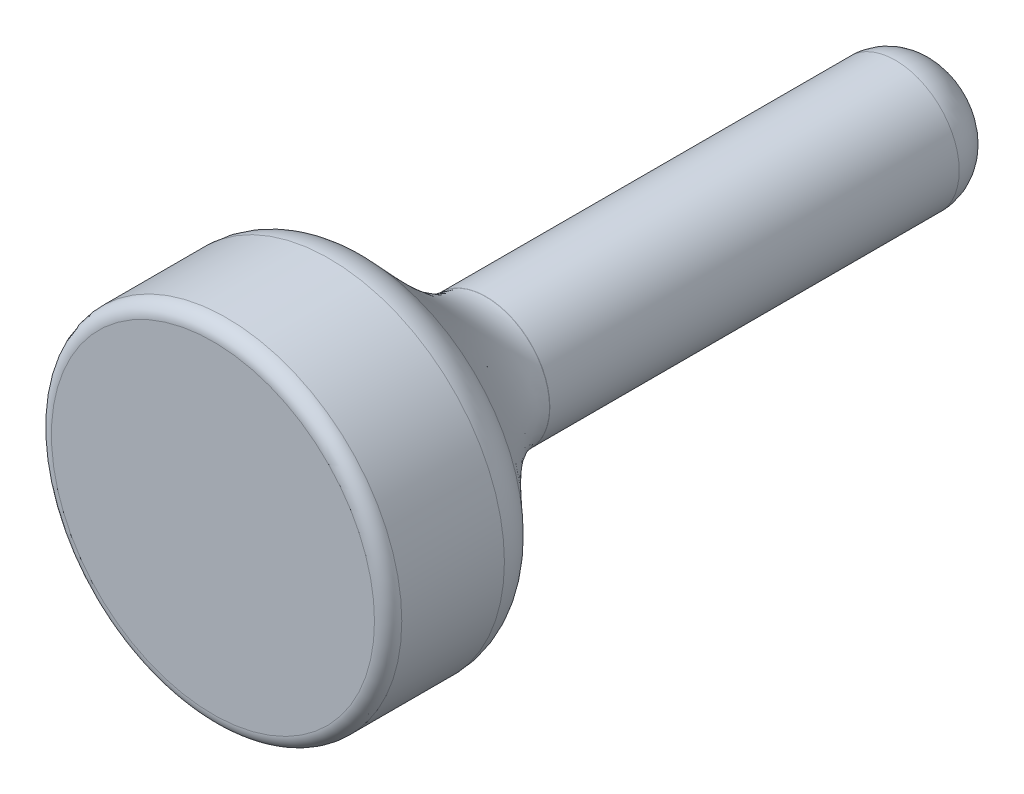
ISO-10303-21;
HEADER;
FILE_DESCRIPTION(('STEP AP214'),'2;1');
FILE_NAME('part.step','',(''),(''),'','','');
FILE_SCHEMA(('AUTOMOTIVE_DESIGN { 1 0 10303 214 1 1 1 1 }'));
ENDSEC;
DATA;
#1=APPLICATION_CONTEXT('core data for automotive mechanical design processes');
#2=APPLICATION_PROTOCOL_DEFINITION('international standard','automotive_design',2000,#1);
#3=PRODUCT_CONTEXT('',#1,'mechanical');
#4=PRODUCT('Part','Part','',(#3));
#5=PRODUCT_RELATED_PRODUCT_CATEGORY('part','',(#4));
#6=PRODUCT_DEFINITION_FORMATION('','',#4);
#7=PRODUCT_DEFINITION_CONTEXT('part definition',#1,'design');
#8=PRODUCT_DEFINITION('design','',#6,#7);
#9=PRODUCT_DEFINITION_SHAPE('','',#8);
#10=(LENGTH_UNIT() NAMED_UNIT(*) SI_UNIT(.MILLI.,.METRE.));
#11=(NAMED_UNIT(*) PLANE_ANGLE_UNIT() SI_UNIT($,.RADIAN.));
#12=(NAMED_UNIT(*) SI_UNIT($,.STERADIAN.) SOLID_ANGLE_UNIT());
#13=UNCERTAINTY_MEASURE_WITH_UNIT(LENGTH_MEASURE(1.E-05),#10,'distance_accuracy_value','');
#14=(GEOMETRIC_REPRESENTATION_CONTEXT(3) GLOBAL_UNCERTAINTY_ASSIGNED_CONTEXT((#13)) GLOBAL_UNIT_ASSIGNED_CONTEXT((#10,
#11,#12)) REPRESENTATION_CONTEXT('',''));
#15=CARTESIAN_POINT('',(0.,0.,0.));
#16=DIRECTION('',(0.,0.,1.));
#17=DIRECTION('',(1.,0.,0.));
#18=AXIS2_PLACEMENT_3D('',#15,#16,#17);
#19=CARTESIAN_POINT('',(0.,0.,3.));
#20=DIRECTION('',(0.,0.,-1.));
#21=DIRECTION('',(-1.,0.,0.));
#22=AXIS2_PLACEMENT_3D('',#19,#20,#21);
#23=CYLINDRICAL_SURFACE('',#22,3.85);
#24=CARTESIAN_POINT('',(0.,0.,2.7));
#25=DIRECTION('',(0.,0.,1.));
#26=DIRECTION('',(1.,0.,0.));
#27=AXIS2_PLACEMENT_3D('',#24,#25,#26);
#28=CIRCLE('',#27,3.85);
#29=CARTESIAN_POINT('',(3.85,0.,2.7));
#30=VERTEX_POINT('',#29);
#31=EDGE_CURVE('E11',#30,#30,#28,.F.);
#32=ORIENTED_EDGE('',*,*,#31,.T.);
#33=EDGE_LOOP('',(#32));
#34=FACE_BOUND('',#33,.T.);
#35=CARTESIAN_POINT('',(0.,0.,0.444868123086891));
#36=DIRECTION('',(0.,0.,1.));
#37=DIRECTION('',(1.,0.,0.));
#38=AXIS2_PLACEMENT_3D('',#35,#36,#37);
#39=CIRCLE('',#38,3.85);
#40=CARTESIAN_POINT('',(3.85,0.,0.444868123086891));
#41=VERTEX_POINT('',#40);
#42=EDGE_CURVE('E60',#41,#41,#39,.T.);
#43=ORIENTED_EDGE('',*,*,#42,.T.);
#44=EDGE_LOOP('',(#43));
#45=FACE_BOUND('',#44,.T.);
#46=ADVANCED_FACE('F34',(#34,#45),#23,.T.);
#47=CARTESIAN_POINT('',(0.,0.,3.));
#48=DIRECTION('',(0.,0.,1.));
#49=DIRECTION('',(1.,0.,0.));
#50=AXIS2_PLACEMENT_3D('',#47,#48,#49);
#51=PLANE('',#50);
#52=CARTESIAN_POINT('',(0.,0.,3.));
#53=DIRECTION('',(0.,0.,1.));
#54=DIRECTION('',(1.,0.,0.));
#55=AXIS2_PLACEMENT_3D('',#52,#53,#54);
#56=CIRCLE('',#55,3.55);
#57=CARTESIAN_POINT('',(3.55,0.,3.));
#58=VERTEX_POINT('',#57);
#59=EDGE_CURVE('E41',#58,#58,#56,.T.);
#60=ORIENTED_EDGE('',*,*,#59,.T.);
#61=EDGE_LOOP('',(#60));
#62=FACE_BOUND('',#61,.T.);
#63=ADVANCED_FACE('F88',(#62),#51,.T.);
#64=CARTESIAN_POINT('',(1.93267632489782,3.32975407848379,0.));
#65=CARTESIAN_POINT('',(1.38164535738255,-0.225955983375615,-3.));
#66=CARTESIAN_POINT('',(8.59218448186541,-0.535598571311848,0.));
#67=CARTESIAN_POINT('',(0.929733390631321,-2.98924669814072,-3.));
#68=CARTESIAN_POINT('',(4.72683183206976,-7.19510672827944,0.));
#69=CARTESIAN_POINT('',(-1.83355732413378,-2.53733473138949,-3.));
#70=CARTESIAN_POINT('',(-1.93267632489782,-3.32975407848379,0.));
#71=CARTESIAN_POINT('',(-1.38164535738255,0.225955983375616,-3.));
#72=CARTESIAN_POINT('',(-8.59218448186541,0.535598571311851,0.));
#73=CARTESIAN_POINT('',(-0.92973339063132,2.98924669814072,-3.));
#74=CARTESIAN_POINT('',(-4.72683183206977,7.19510672827944,0.));
#75=CARTESIAN_POINT('',(1.83355732413378,2.53733473138949,-3.));
#76=CARTESIAN_POINT('',(1.93267632489782,3.32975407848379,0.));
#77=CARTESIAN_POINT('',(1.38164535738255,-0.225955983375615,-3.));
#78=(BOUNDED_SURFACE() B_SPLINE_SURFACE(3,1,((#64,#65),(#66,#67),(#68,#69),(#70,#71),(#72,#73),
(#74,#75),(#76,#77)),.UNSPECIFIED.,.T.,.F.,.F.) B_SPLINE_SURFACE_WITH_KNOTS((4,3,4),(2,2),(0.,
0.5,1.),(0.,1.),.UNSPECIFIED.) GEOMETRIC_REPRESENTATION_ITEM() RATIONAL_B_SPLINE_SURFACE(((1.,
1.),(0.333333333333333,0.333333333333333),(0.333333333333333,0.333333333333333),(1.,1.),
(0.333333333333333,0.333333333333333),(0.333333333333333,0.333333333333333),(1.,1.))) REPRESENTATION_ITEM('') SURFACE());
#79=CARTESIAN_POINT('',(0.,0.,-2.99709545008863));
#80=DIRECTION('',(0.,0.,-1.));
#81=DIRECTION('',(-1.,0.,0.));
#82=AXIS2_PLACEMENT_3D('',#79,#80,#81);
#83=CIRCLE('',#82,1.39997521623012);
#84=CARTESIAN_POINT('',(1.38217885636517,-0.222513404260607,-2.99709545008863));
#85=VERTEX_POINT('',#84);
#86=EDGE_CURVE('E45',#85,#85,#83,.F.);
#87=CARTESIAN_POINT('',(0.,0.,-0.295252106152373));
#88=DIRECTION('',(0.,0.,-1.));
#89=DIRECTION('',(-1.,0.,0.));
#90=AXIS2_PLACEMENT_3D('',#87,#88,#89);
#91=CIRCLE('',#90,3.52247456923724);
#92=CARTESIAN_POINT('',(1.87844530699313,2.9798104502734,-0.295252106152373));
#93=VERTEX_POINT('',#92);
#94=EDGE_CURVE('E63',#93,#93,#91,.T.);
#95=CARTESIAN_POINT('',(1.38217885636517,-0.222513404260607,-2.99709545008863));
#96=CARTESIAN_POINT('',(1.38734829855921,-0.189155864109211,-2.9689512485893));
#97=CARTESIAN_POINT('',(1.39251774075325,-0.155798323957815,-2.94080704708996));
#98=CARTESIAN_POINT('',(1.40285662514134,-0.0890832436550234,-2.88451864409129));
#99=CARTESIAN_POINT('',(1.40802606733538,-0.0557257035036275,-2.85637444259195));
#100=CARTESIAN_POINT('',(1.41836495172346,0.0109893767991643,-2.80008603959328));
#101=CARTESIAN_POINT('',(1.4235343939175,0.0443469169505602,-2.77194183809394));
#102=CARTESIAN_POINT('',(1.43387327830558,0.111061997253352,-2.71565343509527));
#103=CARTESIAN_POINT('',(1.43904272049962,0.144419537404748,-2.68750923359594));
#104=CARTESIAN_POINT('',(1.44938160488771,0.21113461770754,-2.63122083059726));
#105=CARTESIAN_POINT('',(1.45455104708175,0.244492157858936,-2.60307662909793));
#106=CARTESIAN_POINT('',(1.46488993146983,0.311207238161728,-2.54678822609926));
#107=CARTESIAN_POINT('',(1.47005937366387,0.344564778313123,-2.51864402459992));
#108=CARTESIAN_POINT('',(1.48039825805196,0.411279858615915,-2.46235562160125));
#109=CARTESIAN_POINT('',(1.485567700246,0.444637398767311,-2.43421142010191));
#110=CARTESIAN_POINT('',(1.49590658463408,0.511352479070103,-2.37792301710324));
#111=CARTESIAN_POINT('',(1.50107602682812,0.544710019221499,-2.3497788156039));
#112=CARTESIAN_POINT('',(1.5114149112162,0.611425099524291,-2.29349041260523));
#113=CARTESIAN_POINT('',(1.51658435341024,0.644782639675687,-2.2653462111059));
#114=CARTESIAN_POINT('',(1.52692323779833,0.711497719978479,-2.20905780810722));
#115=CARTESIAN_POINT('',(1.53209267999237,0.744855260129874,-2.18091360660789));
#116=CARTESIAN_POINT('',(1.54243156438045,0.811570340432666,-2.12462520360922));
#117=CARTESIAN_POINT('',(1.54760100657449,0.844927880584062,-2.09648100210988));
#118=CARTESIAN_POINT('',(1.55793989096257,0.911642960886854,-2.04019259911121));
#119=CARTESIAN_POINT('',(1.56310933315662,0.94500050103825,-2.01204839761187));
#120=CARTESIAN_POINT('',(1.5734482175447,1.01171558134104,-1.9557599946132));
#121=CARTESIAN_POINT('',(1.57861765973874,1.04507312149244,-1.92761579311386));
#122=CARTESIAN_POINT('',(1.58895654412682,1.11178820179523,-1.87132739011519));
#123=CARTESIAN_POINT('',(1.59412598632086,1.14514574194663,-1.84318318861586));
#124=CARTESIAN_POINT('',(1.60446487070895,1.21186082224942,-1.78689478561718));
#125=CARTESIAN_POINT('',(1.60963431290299,1.24521836240081,-1.75875058411785));
#126=CARTESIAN_POINT('',(1.61997319729107,1.3119334427036,-1.70246218111918));
#127=CARTESIAN_POINT('',(1.62514263948511,1.345290982855,-1.67431797961984));
#128=CARTESIAN_POINT('',(1.63548152387319,1.41200606315779,-1.61802957662117));
#129=CARTESIAN_POINT('',(1.64065096606723,1.44536360330919,-1.58988537512183));
#130=CARTESIAN_POINT('',(1.65098985045532,1.51207868361198,-1.53359697212316));
#131=CARTESIAN_POINT('',(1.65615929264936,1.54543622376338,-1.50545277062382));
#132=CARTESIAN_POINT('',(1.66649817703744,1.61215130406617,-1.44916436762515));
#133=CARTESIAN_POINT('',(1.67166761923148,1.64550884421756,-1.42102016612581));
#134=CARTESIAN_POINT('',(1.68200650361956,1.71222392452036,-1.36473176312714));
#135=CARTESIAN_POINT('',(1.68717594581361,1.74558146467175,-1.33658756162781));
#136=CARTESIAN_POINT('',(1.69751483020169,1.81229654497454,-1.28029915862913));
#137=CARTESIAN_POINT('',(1.70268427239573,1.84565408512594,-1.2521549571298));
#138=CARTESIAN_POINT('',(1.71302315678381,1.91236916542873,-1.19586655413113));
#139=CARTESIAN_POINT('',(1.71819259897785,1.94572670558013,-1.16772235263179));
#140=CARTESIAN_POINT('',(1.72853148336594,2.01244178588292,-1.11143394963312));
#141=CARTESIAN_POINT('',(1.73370092555998,2.04579932603431,-1.08328974813378));
#142=CARTESIAN_POINT('',(1.74403980994806,2.11251440633711,-1.02700134513511));
#143=CARTESIAN_POINT('',(1.7492092521421,2.1458719464885,-0.998857143635774));
#144=CARTESIAN_POINT('',(1.75954813653018,2.21258702679129,-0.942568740637102));
#145=CARTESIAN_POINT('',(1.76471757872422,2.24594456694269,-0.914424539137766));
#146=CARTESIAN_POINT('',(1.77505646311231,2.31265964724548,-0.858136136139094));
#147=CARTESIAN_POINT('',(1.78022590530635,2.34601718739688,-0.829991934639758));
#148=CARTESIAN_POINT('',(1.79056478969443,2.41273226769967,-0.773703531641086));
#149=CARTESIAN_POINT('',(1.79573423188847,2.44608980785107,-0.74555933014175));
#150=CARTESIAN_POINT('',(1.80607311627656,2.51280488815386,-0.689270927143078));
#151=CARTESIAN_POINT('',(1.8112425584706,2.54616242830525,-0.661126725643742));
#152=CARTESIAN_POINT('',(1.82158144285868,2.61287750860805,-0.60483832264507));
#153=CARTESIAN_POINT('',(1.82675088505272,2.64623504875944,-0.576694121145734));
#154=CARTESIAN_POINT('',(1.8370897694408,2.71295012906223,-0.520405718147062));
#155=CARTESIAN_POINT('',(1.84225921163484,2.74630766921363,-0.492261516647726));
#156=CARTESIAN_POINT('',(1.85259809602293,2.81302274951642,-0.435973113649054));
#157=CARTESIAN_POINT('',(1.85776753821697,2.84638028966782,-0.407828912149718));
#158=CARTESIAN_POINT('',(1.86810642260505,2.91309536997061,-0.351540509151046));
#159=CARTESIAN_POINT('',(1.87327586479909,2.946452910122,-0.32339630765171));
#160=CARTESIAN_POINT('',(1.87844530699313,2.9798104502734,-0.295252106152374));
#161=B_SPLINE_CURVE_WITH_KNOTS('',3,(#95,#96,#97,#98,#99,#100,#101,#102,#103,#104,#105,#106,
#107,#108,#109,#110,#111,#112,#113,#114,#115,#116,#117,#118,#119,#120,#121,#122,#123,#124,#125,
#126,#127,#128,#129,#130,#131,#132,#133,#134,#135,#136,#137,#138,#139,#140,#141,#142,#143,#144,
#145,#146,#147,#148,#149,#150,#151,#152,#153,#154,#155,#156,#157,#158,#159,#160),.UNSPECIFIED.,
.F.,.F.,(4,2,2,2,2,2,2,2,2,2,2,2,2,2,2,2,2,2,2,2,2,2,2,2,2,2,2,2,2,2,2,2,4),(0.,
0.131848027138304,0.263696054276607,0.39554408141491,0.527392108553214,0.659240135691517,
0.79108816282982,0.922936189968123,1.05478421710643,1.18663224424473,1.31848027138303,
1.45032829852134,1.58217632565964,1.71402435279794,1.84587237993625,1.97772040707455,
2.10956843421285,2.24141646135116,2.37326448848946,2.50511251562776,2.63696054276607,
2.76880856990437,2.90065659704267,3.03250462418098,3.16435265131928,3.29620067845758,
3.42804870559589,3.55989673273419,3.69174475987249,3.8235927870108,3.9554408141491,
4.0872888412874,4.21913686842571),.UNSPECIFIED.);
#162=EDGE_CURVE('BSEAM67',#85,#93,#161,.T.);
#163=ORIENTED_EDGE('',*,*,#86,.T.);
#164=ORIENTED_EDGE('',*,*,#94,.T.);
#165=ORIENTED_EDGE('',*,*,#162,.T.);
#166=ORIENTED_EDGE('',*,*,#162,.F.);
#167=EDGE_LOOP('',(#163,#165,#164,#166));
#168=FACE_BOUND('',#167,.T.);
#169=ADVANCED_FACE('F67',(#168),#78,.T.);
#170=CARTESIAN_POINT('',(0.,0.,-13.));
#171=DIRECTION('',(0.,0.,1.));
#172=DIRECTION('',(1.,0.,0.));
#173=AXIS2_PLACEMENT_3D('',#170,#171,#172);
#174=CYLINDRICAL_SURFACE('',#173,1.4);
#175=CARTESIAN_POINT('',(0.,0.,-3.00413582831155));
#176=DIRECTION('',(0.,0.,1.));
#177=DIRECTION('',(1.,0.,0.));
#178=AXIS2_PLACEMENT_3D('',#175,#176,#177);
#179=CIRCLE('',#178,1.4);
#180=CARTESIAN_POINT('',(1.4,0.,-3.00413582831155));
#181=VERTEX_POINT('',#180);
#182=EDGE_CURVE('E49',#181,#181,#179,.F.);
#183=ORIENTED_EDGE('',*,*,#182,.T.);
#184=EDGE_LOOP('',(#183));
#185=FACE_BOUND('',#184,.T.);
#186=CARTESIAN_POINT('',(0.,0.,-12.));
#187=DIRECTION('',(0.,0.,-1.));
#188=DIRECTION('',(-1.,0.,0.));
#189=AXIS2_PLACEMENT_3D('',#186,#187,#188);
#190=CIRCLE('',#189,1.4);
#191=CARTESIAN_POINT('',(-1.4,0.,-12.));
#192=VERTEX_POINT('',#191);
#193=EDGE_CURVE('E54',#192,#192,#190,.F.);
#194=ORIENTED_EDGE('',*,*,#193,.T.);
#195=EDGE_LOOP('',(#194));
#196=FACE_BOUND('',#195,.T.);
#197=ADVANCED_FACE('F82',(#185,#196),#174,.T.);
#198=CARTESIAN_POINT('',(0.,0.,-13.));
#199=DIRECTION('',(0.,0.,-1.));
#200=DIRECTION('',(-1.,0.,0.));
#201=AXIS2_PLACEMENT_3D('',#198,#199,#200);
#202=PLANE('',#201);
#203=CARTESIAN_POINT('',(0.,0.,-13.));
#204=DIRECTION('',(0.,0.,-1.));
#205=DIRECTION('',(-1.,0.,0.));
#206=AXIS2_PLACEMENT_3D('',#203,#204,#205);
#207=CIRCLE('',#206,0.4);
#208=CARTESIAN_POINT('',(-0.4,0.,-13.));
#209=VERTEX_POINT('',#208);
#210=EDGE_CURVE('E57',#209,#209,#207,.T.);
#211=ORIENTED_EDGE('',*,*,#210,.T.);
#212=EDGE_LOOP('',(#211));
#213=FACE_BOUND('',#212,.T.);
#214=ADVANCED_FACE('F72',(#213),#202,.T.);
#215=CARTESIAN_POINT('',(0.,0.,0.444868123086891));
#216=DIRECTION('',(0.,0.,1.));
#217=DIRECTION('',(1.,0.,0.));
#218=AXIS2_PLACEMENT_3D('',#215,#216,#217);
#219=TOROIDAL_SURFACE('',#218,2.85,1.);
#220=ORIENTED_EDGE('',*,*,#42,.F.);
#221=EDGE_LOOP('',(#220));
#222=FACE_BOUND('',#221,.T.);
#223=ORIENTED_EDGE('',*,*,#94,.F.);
#224=EDGE_LOOP('',(#223));
#225=FACE_BOUND('',#224,.T.);
#226=ADVANCED_FACE('F69',(#222,#225),#219,.T.);
#227=CARTESIAN_POINT('',(0.,0.,-12.));
#228=DIRECTION('',(0.,0.,-1.));
#229=DIRECTION('',(-1.,0.,0.));
#230=AXIS2_PLACEMENT_3D('',#227,#228,#229);
#231=DEGENERATE_TOROIDAL_SURFACE('',#230,0.4,1.,.T.);
#232=ORIENTED_EDGE('',*,*,#193,.F.);
#233=EDGE_LOOP('',(#232));
#234=FACE_BOUND('',#233,.T.);
#235=ORIENTED_EDGE('',*,*,#210,.F.);
#236=EDGE_LOOP('',(#235));
#237=FACE_BOUND('',#236,.T.);
#238=ADVANCED_FACE('F71',(#234,#237),#231,.T.);
#239=CARTESIAN_POINT('',(0.,0.,-3.00413582831155));
#240=DIRECTION('',(0.,0.,1.));
#241=DIRECTION('',(1.,0.,0.));
#242=AXIS2_PLACEMENT_3D('',#239,#240,#241);
#243=DEGENERATE_TOROIDAL_SURFACE('',#242,0.4,1.,.T.);
#244=ORIENTED_EDGE('',*,*,#86,.F.);
#245=EDGE_LOOP('',(#244));
#246=FACE_BOUND('',#245,.T.);
#247=ORIENTED_EDGE('',*,*,#182,.F.);
#248=EDGE_LOOP('',(#247));
#249=FACE_BOUND('',#248,.T.);
#250=ADVANCED_FACE('F79',(#246,#249),#243,.T.);
#251=CARTESIAN_POINT('',(0.,0.,2.7));
#252=DIRECTION('',(0.,0.,1.));
#253=DIRECTION('',(1.,0.,0.));
#254=AXIS2_PLACEMENT_3D('',#251,#252,#253);
#255=TOROIDAL_SURFACE('',#254,3.55,0.3);
#256=ORIENTED_EDGE('',*,*,#31,.F.);
#257=EDGE_LOOP('',(#256));
#258=FACE_BOUND('',#257,.T.);
#259=ORIENTED_EDGE('',*,*,#59,.F.);
#260=EDGE_LOOP('',(#259));
#261=FACE_BOUND('',#260,.T.);
#262=ADVANCED_FACE('F36',(#258,#261),#255,.T.);
#263=CLOSED_SHELL('',(#46,#63,#169,#197,#214,#226,#238,#250,#262));
#264=MANIFOLD_SOLID_BREP('B2',#263);
#265=ADVANCED_BREP_SHAPE_REPRESENTATION('',(#18,#264),#14);
#266=SHAPE_DEFINITION_REPRESENTATION(#9,#265);
ENDSEC;
END-ISO-10303-21;
